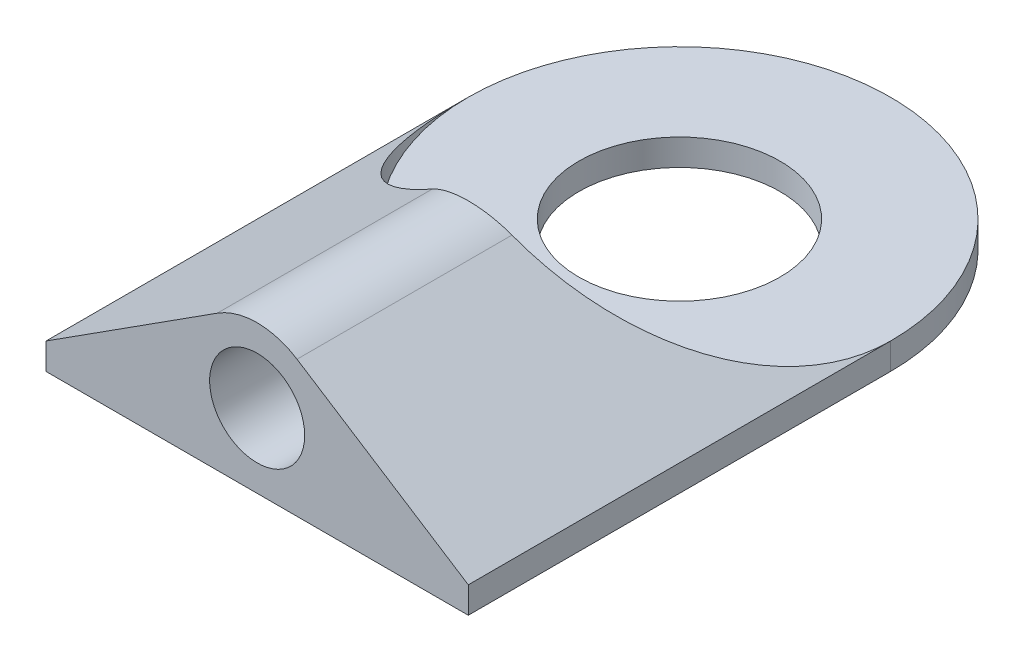
ISO-10303-21;
HEADER;
FILE_DESCRIPTION(('STEP AP214'),'2;1');
FILE_NAME('part.step','',(''),(''),'','','');
FILE_SCHEMA(('AUTOMOTIVE_DESIGN { 1 0 10303 214 1 1 1 1 }'));
ENDSEC;
DATA;
#1=APPLICATION_CONTEXT('core data for automotive mechanical design processes');
#2=APPLICATION_PROTOCOL_DEFINITION('international standard','automotive_design',2000,#1);
#3=PRODUCT_CONTEXT('',#1,'mechanical');
#4=PRODUCT('Part','Part','',(#3));
#5=PRODUCT_RELATED_PRODUCT_CATEGORY('part','',(#4));
#6=PRODUCT_DEFINITION_FORMATION('','',#4);
#7=PRODUCT_DEFINITION_CONTEXT('part definition',#1,'design');
#8=PRODUCT_DEFINITION('design','',#6,#7);
#9=PRODUCT_DEFINITION_SHAPE('','',#8);
#10=(LENGTH_UNIT() NAMED_UNIT(*) SI_UNIT(.MILLI.,.METRE.));
#11=(NAMED_UNIT(*) PLANE_ANGLE_UNIT() SI_UNIT($,.RADIAN.));
#12=(NAMED_UNIT(*) SI_UNIT($,.STERADIAN.) SOLID_ANGLE_UNIT());
#13=UNCERTAINTY_MEASURE_WITH_UNIT(LENGTH_MEASURE(1.E-05),#10,'distance_accuracy_value','');
#14=(GEOMETRIC_REPRESENTATION_CONTEXT(3) GLOBAL_UNCERTAINTY_ASSIGNED_CONTEXT((#13)) GLOBAL_UNIT_ASSIGNED_CONTEXT((#10,
#11,#12)) REPRESENTATION_CONTEXT('',''));
#15=CARTESIAN_POINT('',(0.,0.,0.));
#16=DIRECTION('',(0.,0.,1.));
#17=DIRECTION('',(1.,0.,0.));
#18=AXIS2_PLACEMENT_3D('',#15,#16,#17);
#19=CARTESIAN_POINT('',(0.,5.,0.));
#20=DIRECTION('',(0.,-1.,0.));
#21=DIRECTION('',(0.,0.,-1.));
#22=AXIS2_PLACEMENT_3D('',#19,#20,#21);
#23=CYLINDRICAL_SURFACE('',#22,19.05);
#24=CARTESIAN_POINT('',(0.,0.,0.));
#25=DIRECTION('',(0.,1.,0.));
#26=DIRECTION('',(0.,0.,1.));
#27=AXIS2_PLACEMENT_3D('',#24,#25,#26);
#28=CIRCLE('',#27,19.05);
#29=CARTESIAN_POINT('',(0.,0.,19.05));
#30=VERTEX_POINT('',#29);
#31=EDGE_CURVE('E139',#30,#30,#28,.T.);
#32=ORIENTED_EDGE('',*,*,#31,.F.);
#33=EDGE_LOOP('',(#32));
#34=FACE_BOUND('',#33,.T.);
#35=CARTESIAN_POINT('',(0.,5.,0.));
#36=DIRECTION('',(0.,1.,0.));
#37=DIRECTION('',(0.,0.,1.));
#38=AXIS2_PLACEMENT_3D('',#35,#36,#37);
#39=CIRCLE('',#38,19.05);
#40=CARTESIAN_POINT('',(0.,5.,19.05));
#41=VERTEX_POINT('',#40);
#42=EDGE_CURVE('E137',#41,#41,#39,.T.);
#43=ORIENTED_EDGE('',*,*,#42,.T.);
#44=EDGE_LOOP('',(#43));
#45=FACE_BOUND('',#44,.T.);
#46=ADVANCED_FACE('F33',(#34,#45),#23,.F.);
#47=CARTESIAN_POINT('',(-40.,5.,0.));
#48=DIRECTION('',(-0.539453467950005,0.842015413111134,0.));
#49=DIRECTION('',(-0.842015413111134,-0.539453467950005,0.));
#50=AXIS2_PLACEMENT_3D('',#47,#48,#49);
#51=PLANE('',#50);
#52=DIRECTION('',(0.,0.,1.));
#53=VECTOR('',#52,1.);
#54=CARTESIAN_POINT('',(-7.55234855130007,25.7882157835559,0.));
#55=LINE('',#54,#53);
#56=CARTESIAN_POINT('',(-7.55234855130007,25.7882157835559,39.2805553850716));
#57=VERTEX_POINT('',#56);
#58=CARTESIAN_POINT('',(-7.55234855130007,25.7882157835559,80.));
#59=VERTEX_POINT('',#58);
#60=EDGE_CURVE('E106',#57,#59,#55,.T.);
#61=ORIENTED_EDGE('',*,*,#60,.F.);
#62=CARTESIAN_POINT('',(0.,30.6267740257531,0.));
#63=DIRECTION('',(-0.539453467950005,0.842015413111134,0.));
#64=DIRECTION('',(-0.842015413111134,-0.539453467950005,0.));
#65=AXIS2_PLACEMENT_3D('',#62,#63,#64);
#66=ELLIPSE('',#65,47.505068645009,40.);
#67=CARTESIAN_POINT('',(-40.,5.,0.));
#68=VERTEX_POINT('',#67);
#69=EDGE_CURVE('E91',#57,#68,#66,.F.);
#70=ORIENTED_EDGE('',*,*,#69,.T.);
#71=DIRECTION('',(0.,0.,1.));
#72=VECTOR('',#71,1.);
#73=CARTESIAN_POINT('',(-40.,5.,0.));
#74=LINE('',#73,#72);
#75=CARTESIAN_POINT('',(-40.,5.,80.));
#76=VERTEX_POINT('',#75);
#77=EDGE_CURVE('E104',#68,#76,#74,.T.);
#78=ORIENTED_EDGE('',*,*,#77,.T.);
#79=DIRECTION('',(-0.842015413111134,-0.539453467950005,0.));
#80=VECTOR('',#79,1.);
#81=CARTESIAN_POINT('',(-40.,5.,80.));
#82=LINE('',#81,#80);
#83=EDGE_CURVE('E146',#59,#76,#82,.T.);
#84=ORIENTED_EDGE('',*,*,#83,.F.);
#85=EDGE_LOOP('',(#61,#70,#78,#84));
#86=FACE_BOUND('',#85,.T.);
#87=ADVANCED_FACE('F102',(#86),#51,.T.);
#88=CARTESIAN_POINT('',(0.,14.,0.));
#89=DIRECTION('',(0.,0.,1.));
#90=DIRECTION('',(1.,0.,0.));
#91=AXIS2_PLACEMENT_3D('',#88,#89,#90);
#92=CYLINDRICAL_SURFACE('',#91,14.);
#93=DIRECTION('',(0.,0.,1.));
#94=VECTOR('',#93,1.);
#95=CARTESIAN_POINT('',(7.55234855130007,25.7882157835559,0.));
#96=LINE('',#95,#94);
#97=CARTESIAN_POINT('',(7.55234855130007,25.7882157835559,39.2805553850716));
#98=VERTEX_POINT('',#97);
#99=CARTESIAN_POINT('',(7.55234855130007,25.7882157835559,80.));
#100=VERTEX_POINT('',#99);
#101=EDGE_CURVE('E144',#98,#100,#96,.T.);
#102=ORIENTED_EDGE('',*,*,#101,.F.);
#103=CARTESIAN_POINT('',(7.55234855130007,25.7882157835559,39.2805553850716));
#104=CARTESIAN_POINT('',(7.23392455904056,25.9922580072253,39.3418083907552));
#105=CARTESIAN_POINT('',(6.90684336826604,26.1835724632879,39.4006510009431));
#106=CARTESIAN_POINT('',(6.23735875556341,26.5394926872026,39.5121486598034));
#107=CARTESIAN_POINT('',(5.89495191784169,26.7040924626645,39.5648023194991));
#108=CARTESIAN_POINT('',(5.19671066500966,27.0053420174284,39.6625605131267));
#109=CARTESIAN_POINT('',(4.84086710301217,27.1419723352456,39.707659786687));
#110=CARTESIAN_POINT('',(4.11834033267174,27.3859865408131,39.7890860721227));
#111=CARTESIAN_POINT('',(3.75165812177872,27.4933731105504,39.8254138884065));
#112=CARTESIAN_POINT('',(3.00924781098361,27.6781220905976,39.8883876232255));
#113=CARTESIAN_POINT('',(2.6335040903851,27.7554280312086,39.9150153260336));
#114=CARTESIAN_POINT('',(1.87633504842752,27.8789952655023,39.9577669651901));
#115=CARTESIAN_POINT('',(1.4949095217752,27.9252554346542,39.9738905210598));
#116=CARTESIAN_POINT('',(0.729568149576765,27.9862421821287,39.995176619358));
#117=CARTESIAN_POINT('',(0.345654718190003,28.0009957489468,40.0003485429019));
#118=CARTESIAN_POINT('',(-0.422058966825757,27.9989000078524,39.999614972039));
#119=CARTESIAN_POINT('',(-0.805859225165469,27.9820522849557,39.9937100332107));
#120=CARTESIAN_POINT('',(-1.55983983810844,27.9178326702065,39.9713046862964));
#121=CARTESIAN_POINT('',(-1.93010270758421,27.8713203357958,39.9551026892235));
#122=CARTESIAN_POINT('',(-2.6652076238717,27.7490186005446,39.9128077814965));
#123=CARTESIAN_POINT('',(-3.0300493310723,27.6732273734778,39.8867142538751));
#124=CARTESIAN_POINT('',(-3.75181001899718,27.4930455355575,39.8253073236755));
#125=CARTESIAN_POINT('',(-4.10872876597339,27.3886540821315,39.7899936494701));
#126=CARTESIAN_POINT('',(-4.8122035022511,27.1522006038429,39.7110564532725));
#127=CARTESIAN_POINT('',(-5.15876247248202,27.0201466279172,39.6674353488199));
#128=CARTESIAN_POINT('',(-5.85695269291791,26.7219273609314,39.5705246953018));
#129=CARTESIAN_POINT('',(-6.207931947894,26.5543595716186,39.5168539237368));
#130=CARTESIAN_POINT('',(-6.89304192310798,26.1916397666628,39.4031339157309));
#131=CARTESIAN_POINT('',(-7.22721491058194,25.996562184364,39.3431019961931));
#132=CARTESIAN_POINT('',(-7.55234855130007,25.7882157835559,39.2805553850716));
#133=B_SPLINE_CURVE_WITH_KNOTS('',3,(#103,#104,#105,#106,#107,#108,#109,#110,#111,#112,#113,
#114,#115,#116,#117,#118,#119,#120,#121,#122,#123,#124,#125,#126,#127,#128,#129,#130,#131,#132),
.UNSPECIFIED.,.F.,.F.,(4,2,2,2,2,2,2,2,2,2,2,2,2,2,4),(0.,1.14908659983096,2.29843059698638,
3.44857162340267,4.59860713314938,5.75079128161216,6.90301716189984,8.05425565113821,
9.20543639961668,10.324688790023,11.4440110033675,12.5633661958755,13.682396141986,
14.8588384694174,16.0321566800123),.UNSPECIFIED.);
#134=EDGE_CURVE('E108',#98,#57,#133,.T.);
#135=ORIENTED_EDGE('',*,*,#134,.T.);
#136=ORIENTED_EDGE('',*,*,#60,.T.);
#137=CARTESIAN_POINT('',(0.,14.,80.));
#138=DIRECTION('',(0.,0.,1.));
#139=DIRECTION('',(1.,0.,0.));
#140=AXIS2_PLACEMENT_3D('',#137,#138,#139);
#141=CIRCLE('',#140,14.);
#142=EDGE_CURVE('E149',#100,#59,#141,.T.);
#143=ORIENTED_EDGE('',*,*,#142,.F.);
#144=EDGE_LOOP('',(#102,#135,#136,#143));
#145=FACE_BOUND('',#144,.T.);
#146=ADVANCED_FACE('F164',(#145),#92,.T.);
#147=CARTESIAN_POINT('',(40.,5.,0.));
#148=DIRECTION('',(0.539453467950005,0.842015413111134,0.));
#149=DIRECTION('',(-0.842015413111134,0.539453467950005,0.));
#150=AXIS2_PLACEMENT_3D('',#147,#148,#149);
#151=PLANE('',#150);
#152=DIRECTION('',(0.,0.,-1.));
#153=VECTOR('',#152,1.);
#154=CARTESIAN_POINT('',(40.,5.,80.));
#155=LINE('',#154,#153);
#156=CARTESIAN_POINT('',(40.,5.,80.));
#157=VERTEX_POINT('',#156);
#158=CARTESIAN_POINT('',(40.,5.,0.));
#159=VERTEX_POINT('',#158);
#160=EDGE_CURVE('E117',#157,#159,#155,.T.);
#161=ORIENTED_EDGE('',*,*,#160,.T.);
#162=CARTESIAN_POINT('',(0.,30.6267740257531,0.));
#163=DIRECTION('',(0.539453467950005,0.842015413111134,0.));
#164=DIRECTION('',(0.842015413111134,-0.539453467950005,0.));
#165=AXIS2_PLACEMENT_3D('',#162,#163,#164);
#166=ELLIPSE('',#165,47.505068645009,40.);
#167=EDGE_CURVE('E94',#159,#98,#166,.F.);
#168=ORIENTED_EDGE('',*,*,#167,.T.);
#169=ORIENTED_EDGE('',*,*,#101,.T.);
#170=DIRECTION('',(-0.842015413111134,0.539453467950005,0.));
#171=VECTOR('',#170,1.);
#172=CARTESIAN_POINT('',(40.,5.,80.));
#173=LINE('',#172,#171);
#174=EDGE_CURVE('E152',#157,#100,#173,.T.);
#175=ORIENTED_EDGE('',*,*,#174,.F.);
#176=EDGE_LOOP('',(#161,#168,#169,#175));
#177=FACE_BOUND('',#176,.T.);
#178=ADVANCED_FACE('F178',(#177),#151,.T.);
#179=CARTESIAN_POINT('',(0.,14.,0.));
#180=DIRECTION('',(0.,0.,1.));
#181=DIRECTION('',(1.,0.,0.));
#182=AXIS2_PLACEMENT_3D('',#179,#180,#181);
#183=CYLINDRICAL_SURFACE('',#182,9.);
#184=CARTESIAN_POINT('',(0.,14.,80.));
#185=DIRECTION('',(0.,0.,1.));
#186=DIRECTION('',(1.,0.,0.));
#187=AXIS2_PLACEMENT_3D('',#184,#185,#186);
#188=CIRCLE('',#187,9.);
#189=CARTESIAN_POINT('',(9.,14.,80.));
#190=VERTEX_POINT('',#189);
#191=EDGE_CURVE('E107',#190,#190,#188,.T.);
#192=ORIENTED_EDGE('',*,*,#191,.T.);
#193=EDGE_LOOP('',(#192));
#194=FACE_BOUND('',#193,.T.);
#195=CARTESIAN_POINT('',(0.,14.,50.));
#196=DIRECTION('',(0.,0.,-1.));
#197=DIRECTION('',(-1.,0.,0.));
#198=AXIS2_PLACEMENT_3D('',#195,#196,#197);
#199=CIRCLE('',#198,9.);
#200=CARTESIAN_POINT('',(-9.,14.,50.));
#201=VERTEX_POINT('',#200);
#202=EDGE_CURVE('E11',#201,#201,#199,.F.);
#203=ORIENTED_EDGE('',*,*,#202,.F.);
#204=EDGE_LOOP('',(#203));
#205=FACE_BOUND('',#204,.T.);
#206=ADVANCED_FACE('F176',(#194,#205),#183,.F.);
#207=CARTESIAN_POINT('',(0.,5.,0.));
#208=DIRECTION('',(0.,1.,0.));
#209=DIRECTION('',(0.,0.,1.));
#210=AXIS2_PLACEMENT_3D('',#207,#208,#209);
#211=PLANE('',#210);
#212=ORIENTED_EDGE('',*,*,#42,.F.);
#213=EDGE_LOOP('',(#212));
#214=FACE_BOUND('',#213,.T.);
#215=CARTESIAN_POINT('',(0.,5.,0.));
#216=DIRECTION('',(0.,1.,0.));
#217=DIRECTION('',(0.,0.,1.));
#218=AXIS2_PLACEMENT_3D('',#215,#216,#217);
#219=CIRCLE('',#218,40.);
#220=EDGE_CURVE('E118',#159,#68,#219,.T.);
#221=ORIENTED_EDGE('',*,*,#220,.T.);
#222=CARTESIAN_POINT('',(0.,5.,0.));
#223=DIRECTION('',(0.,1.,0.));
#224=DIRECTION('',(0.,0.,1.));
#225=AXIS2_PLACEMENT_3D('',#222,#223,#224);
#226=CIRCLE('',#225,40.);
#227=EDGE_CURVE('E88',#68,#159,#226,.T.);
#228=ORIENTED_EDGE('',*,*,#227,.T.);
#229=EDGE_LOOP('',(#221,#228));
#230=FACE_BOUND('',#229,.T.);
#231=ADVANCED_FACE('F121',(#214,#230),#211,.T.);
#232=CARTESIAN_POINT('',(0.,0.,0.));
#233=DIRECTION('',(0.,1.,0.));
#234=DIRECTION('',(0.,0.,1.));
#235=AXIS2_PLACEMENT_3D('',#232,#233,#234);
#236=PLANE('',#235);
#237=ORIENTED_EDGE('',*,*,#31,.T.);
#238=EDGE_LOOP('',(#237));
#239=FACE_BOUND('',#238,.T.);
#240=DIRECTION('',(0.,0.,1.));
#241=VECTOR('',#240,1.);
#242=CARTESIAN_POINT('',(-40.,0.,0.));
#243=LINE('',#242,#241);
#244=CARTESIAN_POINT('',(-40.,0.,0.));
#245=VERTEX_POINT('',#244);
#246=CARTESIAN_POINT('',(-40.,0.,80.));
#247=VERTEX_POINT('',#246);
#248=EDGE_CURVE('E134',#245,#247,#243,.T.);
#249=ORIENTED_EDGE('',*,*,#248,.F.);
#250=CARTESIAN_POINT('',(0.,0.,0.));
#251=DIRECTION('',(0.,1.,0.));
#252=DIRECTION('',(0.,0.,1.));
#253=AXIS2_PLACEMENT_3D('',#250,#251,#252);
#254=CIRCLE('',#253,40.);
#255=CARTESIAN_POINT('',(40.,0.,0.));
#256=VERTEX_POINT('',#255);
#257=EDGE_CURVE('E125',#256,#245,#254,.T.);
#258=ORIENTED_EDGE('',*,*,#257,.F.);
#259=DIRECTION('',(0.,0.,-1.));
#260=VECTOR('',#259,1.);
#261=CARTESIAN_POINT('',(40.,0.,80.));
#262=LINE('',#261,#260);
#263=CARTESIAN_POINT('',(40.,0.,80.));
#264=VERTEX_POINT('',#263);
#265=EDGE_CURVE('E48',#264,#256,#262,.T.);
#266=ORIENTED_EDGE('',*,*,#265,.F.);
#267=DIRECTION('',(1.,0.,0.));
#268=VECTOR('',#267,1.);
#269=CARTESIAN_POINT('',(-40.,0.,80.));
#270=LINE('',#269,#268);
#271=EDGE_CURVE('E56',#247,#264,#270,.T.);
#272=ORIENTED_EDGE('',*,*,#271,.F.);
#273=EDGE_LOOP('',(#249,#258,#266,#272));
#274=FACE_BOUND('',#273,.T.);
#275=ADVANCED_FACE('F195',(#239,#274),#236,.F.);
#276=CARTESIAN_POINT('',(0.,5.,0.));
#277=DIRECTION('',(0.,-1.,0.));
#278=DIRECTION('',(0.,0.,-1.));
#279=AXIS2_PLACEMENT_3D('',#276,#277,#278);
#280=CYLINDRICAL_SURFACE('',#279,40.);
#281=ORIENTED_EDGE('',*,*,#257,.T.);
#282=DIRECTION('',(0.,-1.,0.));
#283=VECTOR('',#282,1.);
#284=CARTESIAN_POINT('',(-40.,5.,0.));
#285=LINE('',#284,#283);
#286=EDGE_CURVE('E41',#68,#245,#285,.T.);
#287=ORIENTED_EDGE('',*,*,#286,.F.);
#288=ORIENTED_EDGE('',*,*,#220,.F.);
#289=DIRECTION('',(0.,-1.,0.));
#290=VECTOR('',#289,1.);
#291=CARTESIAN_POINT('',(40.,5.,0.));
#292=LINE('',#291,#290);
#293=EDGE_CURVE('E130',#159,#256,#292,.T.);
#294=ORIENTED_EDGE('',*,*,#293,.T.);
#295=EDGE_LOOP('',(#281,#287,#288,#294));
#296=FACE_BOUND('',#295,.T.);
#297=ADVANCED_FACE('F35',(#296),#280,.T.);
#298=CARTESIAN_POINT('',(-40.,5.,0.));
#299=DIRECTION('',(1.,0.,0.));
#300=DIRECTION('',(0.,0.,-1.));
#301=AXIS2_PLACEMENT_3D('',#298,#299,#300);
#302=PLANE('',#301);
#303=ORIENTED_EDGE('',*,*,#248,.T.);
#304=DIRECTION('',(0.,-1.,0.));
#305=VECTOR('',#304,1.);
#306=CARTESIAN_POINT('',(-40.,5.,80.));
#307=LINE('',#306,#305);
#308=EDGE_CURVE('E116',#76,#247,#307,.T.);
#309=ORIENTED_EDGE('',*,*,#308,.F.);
#310=ORIENTED_EDGE('',*,*,#77,.F.);
#311=ORIENTED_EDGE('',*,*,#286,.T.);
#312=EDGE_LOOP('',(#303,#309,#310,#311));
#313=FACE_BOUND('',#312,.T.);
#314=ADVANCED_FACE('F113',(#313),#302,.F.);
#315=CARTESIAN_POINT('',(-40.,5.,80.));
#316=DIRECTION('',(0.,0.,-1.));
#317=DIRECTION('',(-1.,0.,0.));
#318=AXIS2_PLACEMENT_3D('',#315,#316,#317);
#319=PLANE('',#318);
#320=ORIENTED_EDGE('',*,*,#191,.F.);
#321=EDGE_LOOP('',(#320));
#322=FACE_BOUND('',#321,.T.);
#323=ORIENTED_EDGE('',*,*,#271,.T.);
#324=DIRECTION('',(0.,-1.,0.));
#325=VECTOR('',#324,1.);
#326=CARTESIAN_POINT('',(40.,5.,80.));
#327=LINE('',#326,#325);
#328=EDGE_CURVE('E126',#157,#264,#327,.T.);
#329=ORIENTED_EDGE('',*,*,#328,.F.);
#330=ORIENTED_EDGE('',*,*,#174,.T.);
#331=ORIENTED_EDGE('',*,*,#142,.T.);
#332=ORIENTED_EDGE('',*,*,#83,.T.);
#333=ORIENTED_EDGE('',*,*,#308,.T.);
#334=EDGE_LOOP('',(#323,#329,#330,#331,#332,#333));
#335=FACE_BOUND('',#334,.T.);
#336=ADVANCED_FACE('F202',(#322,#335),#319,.F.);
#337=CARTESIAN_POINT('',(40.,5.,80.));
#338=DIRECTION('',(-1.,0.,0.));
#339=DIRECTION('',(0.,0.,1.));
#340=AXIS2_PLACEMENT_3D('',#337,#338,#339);
#341=PLANE('',#340);
#342=ORIENTED_EDGE('',*,*,#265,.T.);
#343=ORIENTED_EDGE('',*,*,#293,.F.);
#344=ORIENTED_EDGE('',*,*,#160,.F.);
#345=ORIENTED_EDGE('',*,*,#328,.T.);
#346=EDGE_LOOP('',(#342,#343,#344,#345));
#347=FACE_BOUND('',#346,.T.);
#348=ADVANCED_FACE('F174',(#347),#341,.F.);
#349=CARTESIAN_POINT('',(0.,14.,50.));
#350=DIRECTION('',(0.,0.,-1.));
#351=DIRECTION('',(-1.,0.,0.));
#352=AXIS2_PLACEMENT_3D('',#349,#350,#351);
#353=PLANE('',#352);
#354=ORIENTED_EDGE('',*,*,#202,.T.);
#355=EDGE_LOOP('',(#354));
#356=FACE_BOUND('',#355,.T.);
#357=ADVANCED_FACE('F171',(#356),#353,.F.);
#358=CARTESIAN_POINT('',(0.,28.,0.));
#359=DIRECTION('',(0.,-1.,0.));
#360=DIRECTION('',(0.,0.,-1.));
#361=AXIS2_PLACEMENT_3D('',#358,#359,#360);
#362=CYLINDRICAL_SURFACE('',#361,40.);
#363=ORIENTED_EDGE('',*,*,#134,.F.);
#364=ORIENTED_EDGE('',*,*,#167,.F.);
#365=ORIENTED_EDGE('',*,*,#227,.F.);
#366=ORIENTED_EDGE('',*,*,#69,.F.);
#367=EDGE_LOOP('',(#363,#364,#365,#366));
#368=FACE_BOUND('',#367,.T.);
#369=ADVANCED_FACE('F90',(#368),#362,.F.);
#370=CLOSED_SHELL('',(#46,#87,#146,#178,#206,#231,#275,#297,#314,#336,#348,#357,#369));
#371=MANIFOLD_SOLID_BREP('B2',#370);
#372=ADVANCED_BREP_SHAPE_REPRESENTATION('',(#18,#371),#14);
#373=SHAPE_DEFINITION_REPRESENTATION(#9,#372);
ENDSEC;
END-ISO-10303-21;
